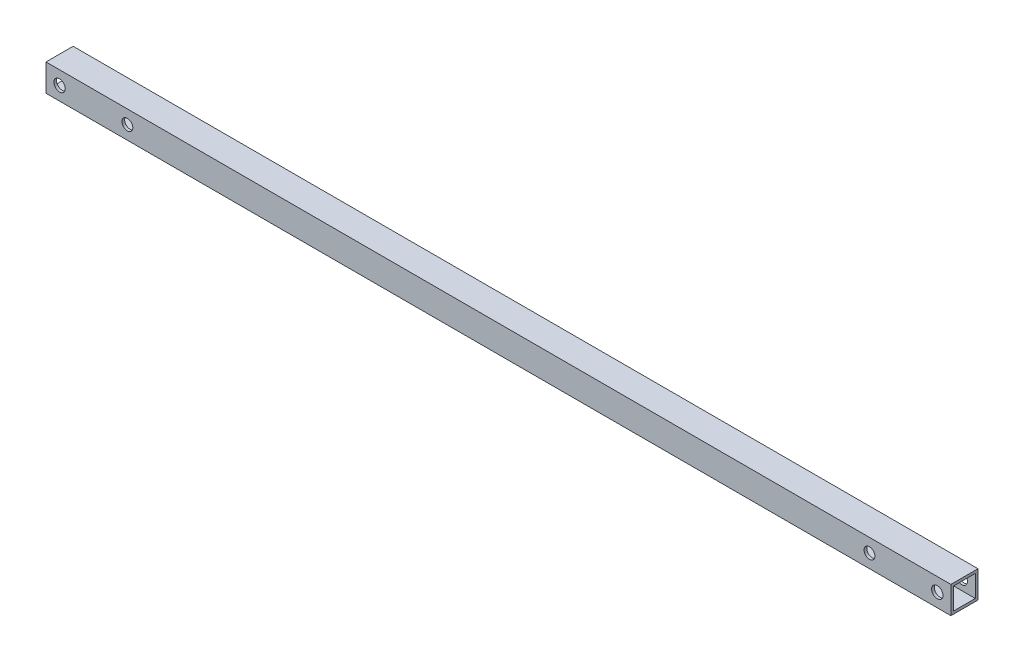
ISO-10303-21;
HEADER;
FILE_DESCRIPTION(('STEP AP214'),'2;1');
FILE_NAME('part.step','',(''),(''),'','','');
FILE_SCHEMA(('AUTOMOTIVE_DESIGN { 1 0 10303 214 1 1 1 1 }'));
ENDSEC;
DATA;
#1=APPLICATION_CONTEXT('core data for automotive mechanical design processes');
#2=APPLICATION_PROTOCOL_DEFINITION('international standard','automotive_design',2000,#1);
#3=PRODUCT_CONTEXT('',#1,'mechanical');
#4=PRODUCT('Part','Part','',(#3));
#5=PRODUCT_RELATED_PRODUCT_CATEGORY('part','',(#4));
#6=PRODUCT_DEFINITION_FORMATION('','',#4);
#7=PRODUCT_DEFINITION_CONTEXT('part definition',#1,'design');
#8=PRODUCT_DEFINITION('design','',#6,#7);
#9=PRODUCT_DEFINITION_SHAPE('','',#8);
#10=(LENGTH_UNIT() NAMED_UNIT(*) SI_UNIT(.MILLI.,.METRE.));
#11=(NAMED_UNIT(*) PLANE_ANGLE_UNIT() SI_UNIT($,.RADIAN.));
#12=(NAMED_UNIT(*) SI_UNIT($,.STERADIAN.) SOLID_ANGLE_UNIT());
#13=UNCERTAINTY_MEASURE_WITH_UNIT(LENGTH_MEASURE(1.E-05),#10,'distance_accuracy_value','');
#14=(GEOMETRIC_REPRESENTATION_CONTEXT(3) GLOBAL_UNCERTAINTY_ASSIGNED_CONTEXT((#13)) GLOBAL_UNIT_ASSIGNED_CONTEXT((#10,
#11,#12)) REPRESENTATION_CONTEXT('',''));
#15=CARTESIAN_POINT('',(0.,0.,0.));
#16=DIRECTION('',(0.,0.,1.));
#17=DIRECTION('',(1.,0.,0.));
#18=AXIS2_PLACEMENT_3D('',#15,#16,#17);
#19=CARTESIAN_POINT('',(333.544819151845,0.,0.));
#20=DIRECTION('',(1.,0.,0.));
#21=DIRECTION('',(0.,0.,-1.));
#22=AXIS2_PLACEMENT_3D('',#19,#20,#21);
#23=PLANE('',#22);
#24=DIRECTION('',(0.,0.,-1.));
#25=VECTOR('',#24,1.);
#26=CARTESIAN_POINT('',(333.544819151845,-5.,-5.));
#27=LINE('',#26,#25);
#28=CARTESIAN_POINT('',(333.544819151845,-5.,5.));
#29=VERTEX_POINT('',#28);
#30=CARTESIAN_POINT('',(333.544819151845,-5.,-5.));
#31=VERTEX_POINT('',#30);
#32=EDGE_CURVE('E181',#29,#31,#27,.T.);
#33=ORIENTED_EDGE('',*,*,#32,.T.);
#34=DIRECTION('',(0.,1.,0.));
#35=VECTOR('',#34,1.);
#36=CARTESIAN_POINT('',(333.544819151845,5.,-5.));
#37=LINE('',#36,#35);
#38=CARTESIAN_POINT('',(333.544819151845,5.,-5.));
#39=VERTEX_POINT('',#38);
#40=EDGE_CURVE('E185',#31,#39,#37,.T.);
#41=ORIENTED_EDGE('',*,*,#40,.T.);
#42=DIRECTION('',(0.,0.,1.));
#43=VECTOR('',#42,1.);
#44=CARTESIAN_POINT('',(333.544819151845,5.,-5.));
#45=LINE('',#44,#43);
#46=CARTESIAN_POINT('',(333.544819151845,5.,5.));
#47=VERTEX_POINT('',#46);
#48=EDGE_CURVE('E189',#39,#47,#45,.T.);
#49=ORIENTED_EDGE('',*,*,#48,.T.);
#50=DIRECTION('',(0.,-1.,0.));
#51=VECTOR('',#50,1.);
#52=CARTESIAN_POINT('',(333.544819151845,5.,5.));
#53=LINE('',#52,#51);
#54=EDGE_CURVE('E192',#47,#29,#53,.T.);
#55=ORIENTED_EDGE('',*,*,#54,.T.);
#56=EDGE_LOOP('',(#33,#41,#49,#55));
#57=FACE_BOUND('',#56,.T.);
#58=DIRECTION('',(0.,1.,0.));
#59=VECTOR('',#58,1.);
#60=CARTESIAN_POINT('',(333.544819151845,5.,-4.));
#61=LINE('',#60,#59);
#62=CARTESIAN_POINT('',(333.544819151845,-4.,-4.));
#63=VERTEX_POINT('',#62);
#64=CARTESIAN_POINT('',(333.544819151845,4.,-4.));
#65=VERTEX_POINT('',#64);
#66=EDGE_CURVE('E140',#63,#65,#61,.T.);
#67=ORIENTED_EDGE('',*,*,#66,.F.);
#68=DIRECTION('',(0.,0.,-1.));
#69=VECTOR('',#68,1.);
#70=CARTESIAN_POINT('',(333.544819151845,-4.,-5.));
#71=LINE('',#70,#69);
#72=CARTESIAN_POINT('',(333.544819151845,-4.,4.));
#73=VERTEX_POINT('',#72);
#74=EDGE_CURVE('E131',#73,#63,#71,.T.);
#75=ORIENTED_EDGE('',*,*,#74,.F.);
#76=DIRECTION('',(0.,-1.,0.));
#77=VECTOR('',#76,1.);
#78=CARTESIAN_POINT('',(333.544819151845,5.,4.));
#79=LINE('',#78,#77);
#80=CARTESIAN_POINT('',(333.544819151845,4.,4.));
#81=VERTEX_POINT('',#80);
#82=EDGE_CURVE('E157',#81,#73,#79,.T.);
#83=ORIENTED_EDGE('',*,*,#82,.F.);
#84=DIRECTION('',(0.,0.,1.));
#85=VECTOR('',#84,1.);
#86=CARTESIAN_POINT('',(333.544819151845,4.,-5.));
#87=LINE('',#86,#85);
#88=EDGE_CURVE('E153',#65,#81,#87,.T.);
#89=ORIENTED_EDGE('',*,*,#88,.F.);
#90=EDGE_LOOP('',(#67,#75,#83,#89));
#91=FACE_BOUND('',#90,.T.);
#92=ADVANCED_FACE('F63',(#57,#91),#23,.T.);
#93=CARTESIAN_POINT('',(0.,0.,0.));
#94=DIRECTION('',(1.,0.,0.));
#95=DIRECTION('',(0.,0.,-1.));
#96=AXIS2_PLACEMENT_3D('',#93,#94,#95);
#97=PLANE('',#96);
#98=DIRECTION('',(0.,0.,-1.));
#99=VECTOR('',#98,1.);
#100=CARTESIAN_POINT('',(0.,-5.,-5.));
#101=LINE('',#100,#99);
#102=CARTESIAN_POINT('',(0.,-5.,5.));
#103=VERTEX_POINT('',#102);
#104=CARTESIAN_POINT('',(0.,-5.,-5.));
#105=VERTEX_POINT('',#104);
#106=EDGE_CURVE('E149',#103,#105,#101,.T.);
#107=ORIENTED_EDGE('',*,*,#106,.F.);
#108=DIRECTION('',(0.,-1.,0.));
#109=VECTOR('',#108,1.);
#110=CARTESIAN_POINT('',(0.,5.,5.));
#111=LINE('',#110,#109);
#112=CARTESIAN_POINT('',(0.,5.,5.));
#113=VERTEX_POINT('',#112);
#114=EDGE_CURVE('E186',#113,#103,#111,.T.);
#115=ORIENTED_EDGE('',*,*,#114,.F.);
#116=DIRECTION('',(0.,0.,1.));
#117=VECTOR('',#116,1.);
#118=CARTESIAN_POINT('',(0.,5.,-5.));
#119=LINE('',#118,#117);
#120=CARTESIAN_POINT('',(0.,5.,-5.));
#121=VERTEX_POINT('',#120);
#122=EDGE_CURVE('E202',#121,#113,#119,.T.);
#123=ORIENTED_EDGE('',*,*,#122,.F.);
#124=DIRECTION('',(0.,1.,0.));
#125=VECTOR('',#124,1.);
#126=CARTESIAN_POINT('',(0.,5.,-5.));
#127=LINE('',#126,#125);
#128=EDGE_CURVE('E199',#105,#121,#127,.T.);
#129=ORIENTED_EDGE('',*,*,#128,.F.);
#130=EDGE_LOOP('',(#107,#115,#123,#129));
#131=FACE_BOUND('',#130,.T.);
#132=DIRECTION('',(0.,0.,-1.));
#133=VECTOR('',#132,1.);
#134=CARTESIAN_POINT('',(0.,-4.,-5.));
#135=LINE('',#134,#133);
#136=CARTESIAN_POINT('',(0.,-4.,4.));
#137=VERTEX_POINT('',#136);
#138=CARTESIAN_POINT('',(0.,-4.,-4.));
#139=VERTEX_POINT('',#138);
#140=EDGE_CURVE('E89',#137,#139,#135,.T.);
#141=ORIENTED_EDGE('',*,*,#140,.T.);
#142=DIRECTION('',(0.,1.,0.));
#143=VECTOR('',#142,1.);
#144=CARTESIAN_POINT('',(0.,5.,-4.));
#145=LINE('',#144,#143);
#146=CARTESIAN_POINT('',(0.,4.,-4.));
#147=VERTEX_POINT('',#146);
#148=EDGE_CURVE('E147',#139,#147,#145,.T.);
#149=ORIENTED_EDGE('',*,*,#148,.T.);
#150=DIRECTION('',(0.,0.,1.));
#151=VECTOR('',#150,1.);
#152=CARTESIAN_POINT('',(0.,4.,-5.));
#153=LINE('',#152,#151);
#154=CARTESIAN_POINT('',(0.,4.,4.));
#155=VERTEX_POINT('',#154);
#156=EDGE_CURVE('E168',#147,#155,#153,.T.);
#157=ORIENTED_EDGE('',*,*,#156,.T.);
#158=DIRECTION('',(0.,-1.,0.));
#159=VECTOR('',#158,1.);
#160=CARTESIAN_POINT('',(0.,5.,4.));
#161=LINE('',#160,#159);
#162=EDGE_CURVE('E141',#155,#137,#161,.T.);
#163=ORIENTED_EDGE('',*,*,#162,.T.);
#164=EDGE_LOOP('',(#141,#149,#157,#163));
#165=FACE_BOUND('',#164,.T.);
#166=ADVANCED_FACE('F266',(#131,#165),#97,.F.);
#167=CARTESIAN_POINT('',(333.544819151845,-5.,-5.));
#168=DIRECTION('',(0.,1.,0.));
#169=DIRECTION('',(0.,0.,1.));
#170=AXIS2_PLACEMENT_3D('',#167,#168,#169);
#171=PLANE('',#170);
#172=ORIENTED_EDGE('',*,*,#106,.T.);
#173=DIRECTION('',(-1.,0.,0.));
#174=VECTOR('',#173,1.);
#175=CARTESIAN_POINT('',(333.544819151845,-5.,-5.));
#176=LINE('',#175,#174);
#177=EDGE_CURVE('E12',#31,#105,#176,.T.);
#178=ORIENTED_EDGE('',*,*,#177,.F.);
#179=ORIENTED_EDGE('',*,*,#32,.F.);
#180=DIRECTION('',(-1.,0.,0.));
#181=VECTOR('',#180,1.);
#182=CARTESIAN_POINT('',(333.544819151845,-5.,5.));
#183=LINE('',#182,#181);
#184=EDGE_CURVE('E195',#29,#103,#183,.T.);
#185=ORIENTED_EDGE('',*,*,#184,.T.);
#186=EDGE_LOOP('',(#172,#178,#179,#185));
#187=FACE_BOUND('',#186,.T.);
#188=ADVANCED_FACE('F65',(#187),#171,.F.);
#189=CARTESIAN_POINT('',(333.544819151845,5.,-5.));
#190=DIRECTION('',(0.,0.,1.));
#191=DIRECTION('',(1.,0.,0.));
#192=AXIS2_PLACEMENT_3D('',#189,#190,#191);
#193=PLANE('',#192);
#194=CARTESIAN_POINT('',(5.,0.,-5.));
#195=DIRECTION('',(0.,0.,1.));
#196=DIRECTION('',(1.,0.,0.));
#197=AXIS2_PLACEMENT_3D('',#194,#195,#196);
#198=CIRCLE('',#197,2.1);
#199=CARTESIAN_POINT('',(7.1,0.,-5.));
#200=VERTEX_POINT('',#199);
#201=EDGE_CURVE('E222',#200,#200,#198,.T.);
#202=ORIENTED_EDGE('',*,*,#201,.T.);
#203=EDGE_LOOP('',(#202));
#204=FACE_BOUND('',#203,.T.);
#205=CARTESIAN_POINT('',(303.544819151845,0.,-5.));
#206=DIRECTION('',(0.,0.,1.));
#207=DIRECTION('',(-1.,0.,0.));
#208=AXIS2_PLACEMENT_3D('',#205,#206,#207);
#209=CIRCLE('',#208,2.00000000000005);
#210=CARTESIAN_POINT('',(301.544819151845,0.,-5.));
#211=VERTEX_POINT('',#210);
#212=EDGE_CURVE('E305',#211,#211,#209,.T.);
#213=ORIENTED_EDGE('',*,*,#212,.T.);
#214=EDGE_LOOP('',(#213));
#215=FACE_BOUND('',#214,.T.);
#216=CARTESIAN_POINT('',(30.,0.,-5.));
#217=DIRECTION('',(0.,0.,1.));
#218=DIRECTION('',(1.,0.,0.));
#219=AXIS2_PLACEMENT_3D('',#216,#217,#218);
#220=CIRCLE('',#219,2.00000000000001);
#221=CARTESIAN_POINT('',(32.,0.,-5.));
#222=VERTEX_POINT('',#221);
#223=EDGE_CURVE('E309',#222,#222,#220,.T.);
#224=ORIENTED_EDGE('',*,*,#223,.T.);
#225=EDGE_LOOP('',(#224));
#226=FACE_BOUND('',#225,.T.);
#227=CARTESIAN_POINT('',(328.544819151845,0.,-5.));
#228=DIRECTION('',(0.,0.,1.));
#229=DIRECTION('',(-1.,0.,0.));
#230=AXIS2_PLACEMENT_3D('',#227,#228,#229);
#231=CIRCLE('',#230,2.09999999999999);
#232=CARTESIAN_POINT('',(326.444819151845,0.,-5.));
#233=VERTEX_POINT('',#232);
#234=EDGE_CURVE('E313',#233,#233,#231,.T.);
#235=ORIENTED_EDGE('',*,*,#234,.T.);
#236=EDGE_LOOP('',(#235));
#237=FACE_BOUND('',#236,.T.);
#238=ORIENTED_EDGE('',*,*,#128,.T.);
#239=DIRECTION('',(-1.,0.,0.));
#240=VECTOR('',#239,1.);
#241=CARTESIAN_POINT('',(333.544819151845,5.,-5.));
#242=LINE('',#241,#240);
#243=EDGE_CURVE('E73',#39,#121,#242,.T.);
#244=ORIENTED_EDGE('',*,*,#243,.F.);
#245=ORIENTED_EDGE('',*,*,#40,.F.);
#246=ORIENTED_EDGE('',*,*,#177,.T.);
#247=EDGE_LOOP('',(#238,#244,#245,#246));
#248=FACE_BOUND('',#247,.T.);
#249=ADVANCED_FACE('F291',(#204,#215,#226,#237,#248),#193,.F.);
#250=CARTESIAN_POINT('',(333.544819151845,5.,-5.));
#251=DIRECTION('',(0.,-1.,0.));
#252=DIRECTION('',(0.,0.,-1.));
#253=AXIS2_PLACEMENT_3D('',#250,#251,#252);
#254=PLANE('',#253);
#255=ORIENTED_EDGE('',*,*,#122,.T.);
#256=DIRECTION('',(-1.,0.,0.));
#257=VECTOR('',#256,1.);
#258=CARTESIAN_POINT('',(333.544819151845,5.,5.));
#259=LINE('',#258,#257);
#260=EDGE_CURVE('E210',#47,#113,#259,.T.);
#261=ORIENTED_EDGE('',*,*,#260,.F.);
#262=ORIENTED_EDGE('',*,*,#48,.F.);
#263=ORIENTED_EDGE('',*,*,#243,.T.);
#264=EDGE_LOOP('',(#255,#261,#262,#263));
#265=FACE_BOUND('',#264,.T.);
#266=ADVANCED_FACE('F288',(#265),#254,.F.);
#267=CARTESIAN_POINT('',(333.544819151845,5.,5.));
#268=DIRECTION('',(0.,0.,-1.));
#269=DIRECTION('',(-1.,0.,0.));
#270=AXIS2_PLACEMENT_3D('',#267,#268,#269);
#271=PLANE('',#270);
#272=CARTESIAN_POINT('',(5.,0.,5.));
#273=DIRECTION('',(0.,0.,1.));
#274=DIRECTION('',(1.,0.,0.));
#275=AXIS2_PLACEMENT_3D('',#272,#273,#274);
#276=CIRCLE('',#275,2.1);
#277=CARTESIAN_POINT('',(7.1,0.,5.));
#278=VERTEX_POINT('',#277);
#279=EDGE_CURVE('E327',#278,#278,#276,.T.);
#280=ORIENTED_EDGE('',*,*,#279,.F.);
#281=EDGE_LOOP('',(#280));
#282=FACE_BOUND('',#281,.T.);
#283=CARTESIAN_POINT('',(303.544819151845,0.,5.));
#284=DIRECTION('',(0.,0.,1.));
#285=DIRECTION('',(-1.,0.,0.));
#286=AXIS2_PLACEMENT_3D('',#283,#284,#285);
#287=CIRCLE('',#286,2.00000000000005);
#288=CARTESIAN_POINT('',(301.544819151845,0.,5.));
#289=VERTEX_POINT('',#288);
#290=EDGE_CURVE('E337',#289,#289,#287,.T.);
#291=ORIENTED_EDGE('',*,*,#290,.F.);
#292=EDGE_LOOP('',(#291));
#293=FACE_BOUND('',#292,.T.);
#294=CARTESIAN_POINT('',(30.,0.,5.));
#295=DIRECTION('',(0.,0.,1.));
#296=DIRECTION('',(1.,0.,0.));
#297=AXIS2_PLACEMENT_3D('',#294,#295,#296);
#298=CIRCLE('',#297,2.00000000000001);
#299=CARTESIAN_POINT('',(32.,0.,5.));
#300=VERTEX_POINT('',#299);
#301=EDGE_CURVE('E341',#300,#300,#298,.T.);
#302=ORIENTED_EDGE('',*,*,#301,.F.);
#303=EDGE_LOOP('',(#302));
#304=FACE_BOUND('',#303,.T.);
#305=CARTESIAN_POINT('',(328.544819151845,0.,5.));
#306=DIRECTION('',(0.,0.,1.));
#307=DIRECTION('',(-1.,0.,0.));
#308=AXIS2_PLACEMENT_3D('',#305,#306,#307);
#309=CIRCLE('',#308,2.09999999999999);
#310=CARTESIAN_POINT('',(326.444819151845,0.,5.));
#311=VERTEX_POINT('',#310);
#312=EDGE_CURVE('E328',#311,#311,#309,.T.);
#313=ORIENTED_EDGE('',*,*,#312,.F.);
#314=EDGE_LOOP('',(#313));
#315=FACE_BOUND('',#314,.T.);
#316=ORIENTED_EDGE('',*,*,#114,.T.);
#317=ORIENTED_EDGE('',*,*,#184,.F.);
#318=ORIENTED_EDGE('',*,*,#54,.F.);
#319=ORIENTED_EDGE('',*,*,#260,.T.);
#320=EDGE_LOOP('',(#316,#317,#318,#319));
#321=FACE_BOUND('',#320,.T.);
#322=ADVANCED_FACE('F285',(#282,#293,#304,#315,#321),#271,.F.);
#323=CARTESIAN_POINT('',(333.544819151845,-4.,-5.));
#324=DIRECTION('',(0.,1.,0.));
#325=DIRECTION('',(0.,0.,1.));
#326=AXIS2_PLACEMENT_3D('',#323,#324,#325);
#327=PLANE('',#326);
#328=ORIENTED_EDGE('',*,*,#140,.F.);
#329=DIRECTION('',(-1.,0.,0.));
#330=VECTOR('',#329,1.);
#331=CARTESIAN_POINT('',(333.544819151845,-4.,4.));
#332=LINE('',#331,#330);
#333=EDGE_CURVE('E135',#73,#137,#332,.T.);
#334=ORIENTED_EDGE('',*,*,#333,.F.);
#335=ORIENTED_EDGE('',*,*,#74,.T.);
#336=DIRECTION('',(-1.,0.,0.));
#337=VECTOR('',#336,1.);
#338=CARTESIAN_POINT('',(333.544819151845,-4.,-4.));
#339=LINE('',#338,#337);
#340=EDGE_CURVE('E134',#63,#139,#339,.T.);
#341=ORIENTED_EDGE('',*,*,#340,.T.);
#342=EDGE_LOOP('',(#328,#334,#335,#341));
#343=FACE_BOUND('',#342,.T.);
#344=ADVANCED_FACE('F133',(#343),#327,.T.);
#345=CARTESIAN_POINT('',(333.544819151845,5.,-4.));
#346=DIRECTION('',(0.,0.,1.));
#347=DIRECTION('',(1.,0.,0.));
#348=AXIS2_PLACEMENT_3D('',#345,#346,#347);
#349=PLANE('',#348);
#350=CARTESIAN_POINT('',(5.,0.,-4.));
#351=DIRECTION('',(0.,0.,1.));
#352=DIRECTION('',(1.,0.,0.));
#353=AXIS2_PLACEMENT_3D('',#350,#351,#352);
#354=CIRCLE('',#353,2.1);
#355=CARTESIAN_POINT('',(7.1,0.,-4.));
#356=VERTEX_POINT('',#355);
#357=EDGE_CURVE('E165',#356,#356,#354,.T.);
#358=ORIENTED_EDGE('',*,*,#357,.F.);
#359=EDGE_LOOP('',(#358));
#360=FACE_BOUND('',#359,.T.);
#361=CARTESIAN_POINT('',(303.544819151845,0.,-4.));
#362=DIRECTION('',(0.,0.,1.));
#363=DIRECTION('',(1.,0.,0.));
#364=AXIS2_PLACEMENT_3D('',#361,#362,#363);
#365=CIRCLE('',#364,2.00000000000005);
#366=CARTESIAN_POINT('',(305.544819151845,0.,-4.));
#367=VERTEX_POINT('',#366);
#368=EDGE_CURVE('E230',#367,#367,#365,.T.);
#369=ORIENTED_EDGE('',*,*,#368,.F.);
#370=EDGE_LOOP('',(#369));
#371=FACE_BOUND('',#370,.T.);
#372=CARTESIAN_POINT('',(30.,0.,-4.));
#373=DIRECTION('',(0.,0.,1.));
#374=DIRECTION('',(1.,0.,0.));
#375=AXIS2_PLACEMENT_3D('',#372,#373,#374);
#376=CIRCLE('',#375,2.00000000000001);
#377=CARTESIAN_POINT('',(32.,0.,-4.));
#378=VERTEX_POINT('',#377);
#379=EDGE_CURVE('E226',#378,#378,#376,.T.);
#380=ORIENTED_EDGE('',*,*,#379,.F.);
#381=EDGE_LOOP('',(#380));
#382=FACE_BOUND('',#381,.T.);
#383=CARTESIAN_POINT('',(328.544819151845,0.,-4.));
#384=DIRECTION('',(0.,0.,1.));
#385=DIRECTION('',(1.,0.,0.));
#386=AXIS2_PLACEMENT_3D('',#383,#384,#385);
#387=CIRCLE('',#386,2.09999999999999);
#388=CARTESIAN_POINT('',(330.644819151845,0.,-4.));
#389=VERTEX_POINT('',#388);
#390=EDGE_CURVE('E221',#389,#389,#387,.T.);
#391=ORIENTED_EDGE('',*,*,#390,.F.);
#392=EDGE_LOOP('',(#391));
#393=FACE_BOUND('',#392,.T.);
#394=ORIENTED_EDGE('',*,*,#148,.F.);
#395=ORIENTED_EDGE('',*,*,#340,.F.);
#396=ORIENTED_EDGE('',*,*,#66,.T.);
#397=DIRECTION('',(-1.,0.,0.));
#398=VECTOR('',#397,1.);
#399=CARTESIAN_POINT('',(333.544819151845,4.,-4.));
#400=LINE('',#399,#398);
#401=EDGE_CURVE('E150',#65,#147,#400,.T.);
#402=ORIENTED_EDGE('',*,*,#401,.T.);
#403=EDGE_LOOP('',(#394,#395,#396,#402));
#404=FACE_BOUND('',#403,.T.);
#405=ADVANCED_FACE('F144',(#360,#371,#382,#393,#404),#349,.T.);
#406=CARTESIAN_POINT('',(333.544819151845,4.,-5.));
#407=DIRECTION('',(0.,-1.,0.));
#408=DIRECTION('',(0.,0.,-1.));
#409=AXIS2_PLACEMENT_3D('',#406,#407,#408);
#410=PLANE('',#409);
#411=ORIENTED_EDGE('',*,*,#156,.F.);
#412=ORIENTED_EDGE('',*,*,#401,.F.);
#413=ORIENTED_EDGE('',*,*,#88,.T.);
#414=DIRECTION('',(-1.,0.,0.));
#415=VECTOR('',#414,1.);
#416=CARTESIAN_POINT('',(333.544819151845,4.,4.));
#417=LINE('',#416,#415);
#418=EDGE_CURVE('E81',#81,#155,#417,.T.);
#419=ORIENTED_EDGE('',*,*,#418,.T.);
#420=EDGE_LOOP('',(#411,#412,#413,#419));
#421=FACE_BOUND('',#420,.T.);
#422=ADVANCED_FACE('F258',(#421),#410,.T.);
#423=CARTESIAN_POINT('',(333.544819151845,5.,4.));
#424=DIRECTION('',(0.,0.,-1.));
#425=DIRECTION('',(-1.,0.,0.));
#426=AXIS2_PLACEMENT_3D('',#423,#424,#425);
#427=PLANE('',#426);
#428=CARTESIAN_POINT('',(5.,0.,4.));
#429=DIRECTION('',(0.,0.,-1.));
#430=DIRECTION('',(-1.,0.,0.));
#431=AXIS2_PLACEMENT_3D('',#428,#429,#430);
#432=CIRCLE('',#431,2.1);
#433=CARTESIAN_POINT('',(2.9,0.,4.));
#434=VERTEX_POINT('',#433);
#435=EDGE_CURVE('E67',#434,#434,#432,.T.);
#436=ORIENTED_EDGE('',*,*,#435,.F.);
#437=EDGE_LOOP('',(#436));
#438=FACE_BOUND('',#437,.T.);
#439=CARTESIAN_POINT('',(303.544819151845,0.,4.));
#440=DIRECTION('',(0.,0.,-1.));
#441=DIRECTION('',(-1.,0.,0.));
#442=AXIS2_PLACEMENT_3D('',#439,#440,#441);
#443=CIRCLE('',#442,2.00000000000005);
#444=CARTESIAN_POINT('',(301.544819151845,0.,4.));
#445=VERTEX_POINT('',#444);
#446=EDGE_CURVE('E227',#445,#445,#443,.T.);
#447=ORIENTED_EDGE('',*,*,#446,.F.);
#448=EDGE_LOOP('',(#447));
#449=FACE_BOUND('',#448,.T.);
#450=CARTESIAN_POINT('',(30.,0.,4.));
#451=DIRECTION('',(0.,0.,-1.));
#452=DIRECTION('',(-1.,0.,0.));
#453=AXIS2_PLACEMENT_3D('',#450,#451,#452);
#454=CIRCLE('',#453,2.00000000000001);
#455=CARTESIAN_POINT('',(28.,0.,4.));
#456=VERTEX_POINT('',#455);
#457=EDGE_CURVE('E223',#456,#456,#454,.T.);
#458=ORIENTED_EDGE('',*,*,#457,.F.);
#459=EDGE_LOOP('',(#458));
#460=FACE_BOUND('',#459,.T.);
#461=CARTESIAN_POINT('',(328.544819151845,0.,4.));
#462=DIRECTION('',(0.,0.,-1.));
#463=DIRECTION('',(-1.,0.,0.));
#464=AXIS2_PLACEMENT_3D('',#461,#462,#463);
#465=CIRCLE('',#464,2.09999999999999);
#466=CARTESIAN_POINT('',(326.444819151845,0.,4.));
#467=VERTEX_POINT('',#466);
#468=EDGE_CURVE('E217',#467,#467,#465,.T.);
#469=ORIENTED_EDGE('',*,*,#468,.F.);
#470=EDGE_LOOP('',(#469));
#471=FACE_BOUND('',#470,.T.);
#472=ORIENTED_EDGE('',*,*,#162,.F.);
#473=ORIENTED_EDGE('',*,*,#418,.F.);
#474=ORIENTED_EDGE('',*,*,#82,.T.);
#475=ORIENTED_EDGE('',*,*,#333,.T.);
#476=EDGE_LOOP('',(#472,#473,#474,#475));
#477=FACE_BOUND('',#476,.T.);
#478=ADVANCED_FACE('F254',(#438,#449,#460,#471,#477),#427,.T.);
#479=CARTESIAN_POINT('',(328.544819151845,0.,-5.));
#480=DIRECTION('',(0.,0.,1.));
#481=DIRECTION('',(1.,0.,0.));
#482=AXIS2_PLACEMENT_3D('',#479,#480,#481);
#483=CYLINDRICAL_SURFACE('',#482,2.09999999999999);
#484=ORIENTED_EDGE('',*,*,#468,.T.);
#485=EDGE_LOOP('',(#484));
#486=FACE_BOUND('',#485,.T.);
#487=ORIENTED_EDGE('',*,*,#312,.T.);
#488=EDGE_LOOP('',(#487));
#489=FACE_BOUND('',#488,.T.);
#490=ADVANCED_FACE('F257',(#486,#489),#483,.F.);
#491=CARTESIAN_POINT('',(30.,0.,-5.));
#492=DIRECTION('',(0.,0.,1.));
#493=DIRECTION('',(1.,0.,0.));
#494=AXIS2_PLACEMENT_3D('',#491,#492,#493);
#495=CYLINDRICAL_SURFACE('',#494,2.00000000000001);
#496=ORIENTED_EDGE('',*,*,#457,.T.);
#497=EDGE_LOOP('',(#496));
#498=FACE_BOUND('',#497,.T.);
#499=ORIENTED_EDGE('',*,*,#301,.T.);
#500=EDGE_LOOP('',(#499));
#501=FACE_BOUND('',#500,.T.);
#502=ADVANCED_FACE('F366',(#498,#501),#495,.F.);
#503=CARTESIAN_POINT('',(303.544819151845,0.,-5.));
#504=DIRECTION('',(0.,0.,1.));
#505=DIRECTION('',(1.,0.,0.));
#506=AXIS2_PLACEMENT_3D('',#503,#504,#505);
#507=CYLINDRICAL_SURFACE('',#506,2.00000000000005);
#508=ORIENTED_EDGE('',*,*,#446,.T.);
#509=EDGE_LOOP('',(#508));
#510=FACE_BOUND('',#509,.T.);
#511=ORIENTED_EDGE('',*,*,#290,.T.);
#512=EDGE_LOOP('',(#511));
#513=FACE_BOUND('',#512,.T.);
#514=ADVANCED_FACE('F367',(#510,#513),#507,.F.);
#515=CARTESIAN_POINT('',(5.,0.,-5.));
#516=DIRECTION('',(0.,0.,1.));
#517=DIRECTION('',(1.,0.,0.));
#518=AXIS2_PLACEMENT_3D('',#515,#516,#517);
#519=CYLINDRICAL_SURFACE('',#518,2.1);
#520=ORIENTED_EDGE('',*,*,#435,.T.);
#521=EDGE_LOOP('',(#520));
#522=FACE_BOUND('',#521,.T.);
#523=ORIENTED_EDGE('',*,*,#279,.T.);
#524=EDGE_LOOP('',(#523));
#525=FACE_BOUND('',#524,.T.);
#526=ADVANCED_FACE('F251',(#522,#525),#519,.F.);
#527=ORIENTED_EDGE('',*,*,#390,.T.);
#528=EDGE_LOOP('',(#527));
#529=FACE_BOUND('',#528,.T.);
#530=ORIENTED_EDGE('',*,*,#234,.F.);
#531=EDGE_LOOP('',(#530));
#532=FACE_BOUND('',#531,.T.);
#533=ADVANCED_FACE('F355',(#529,#532),#483,.F.);
#534=ORIENTED_EDGE('',*,*,#379,.T.);
#535=EDGE_LOOP('',(#534));
#536=FACE_BOUND('',#535,.T.);
#537=ORIENTED_EDGE('',*,*,#223,.F.);
#538=EDGE_LOOP('',(#537));
#539=FACE_BOUND('',#538,.T.);
#540=ADVANCED_FACE('F358',(#536,#539),#495,.F.);
#541=ORIENTED_EDGE('',*,*,#368,.T.);
#542=EDGE_LOOP('',(#541));
#543=FACE_BOUND('',#542,.T.);
#544=ORIENTED_EDGE('',*,*,#212,.F.);
#545=EDGE_LOOP('',(#544));
#546=FACE_BOUND('',#545,.T.);
#547=ADVANCED_FACE('F364',(#543,#546),#507,.F.);
#548=ORIENTED_EDGE('',*,*,#357,.T.);
#549=EDGE_LOOP('',(#548));
#550=FACE_BOUND('',#549,.T.);
#551=ORIENTED_EDGE('',*,*,#201,.F.);
#552=EDGE_LOOP('',(#551));
#553=FACE_BOUND('',#552,.T.);
#554=ADVANCED_FACE('F369',(#550,#553),#519,.F.);
#555=CLOSED_SHELL('',(#92,#166,#188,#249,#266,#322,#344,#405,#422,#478,#490,#502,#514,#526,#533,
#540,#547,#554));
#556=MANIFOLD_SOLID_BREP('B2',#555);
#557=ADVANCED_BREP_SHAPE_REPRESENTATION('',(#18,#556),#14);
#558=SHAPE_DEFINITION_REPRESENTATION(#9,#557);
ENDSEC;
END-ISO-10303-21;
